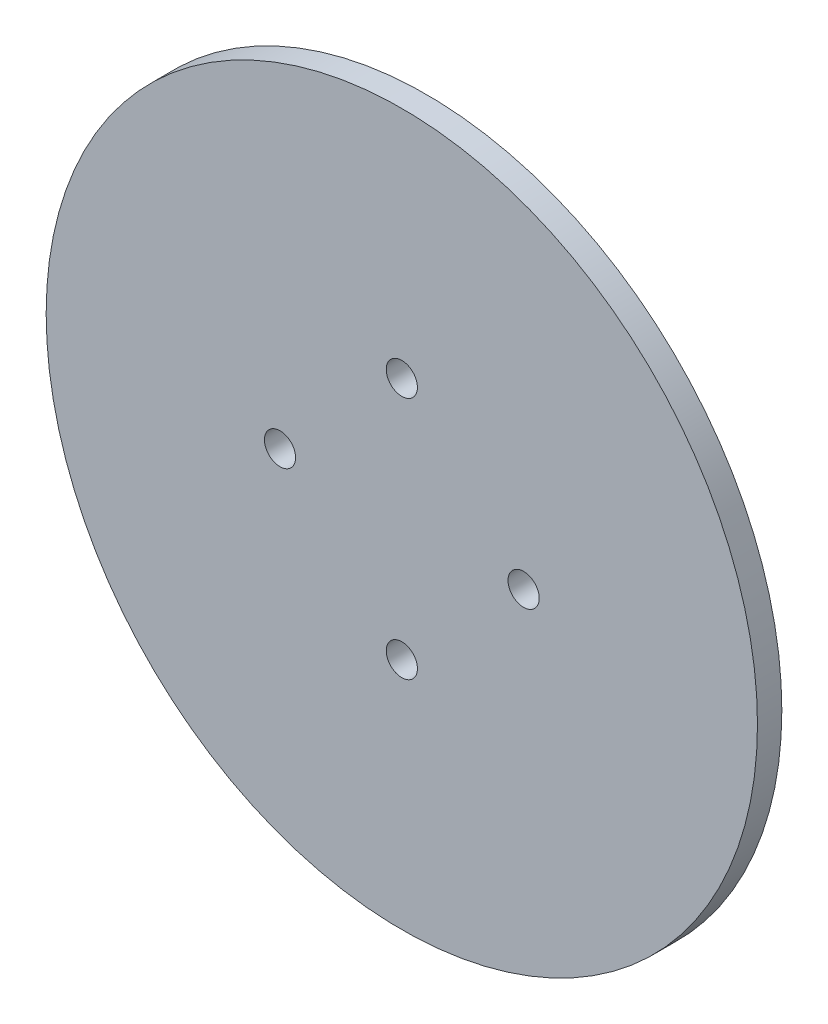
ISO-10303-21;
HEADER;
FILE_DESCRIPTION(('STEP AP214'),'2;1');
FILE_NAME('part.step','',(''),(''),'','','');
FILE_SCHEMA(('AUTOMOTIVE_DESIGN { 1 0 10303 214 1 1 1 1 }'));
ENDSEC;
DATA;
#1=APPLICATION_CONTEXT('core data for automotive mechanical design processes');
#2=APPLICATION_PROTOCOL_DEFINITION('international standard','automotive_design',2000,#1);
#3=PRODUCT_CONTEXT('',#1,'mechanical');
#4=PRODUCT('Part','Part','',(#3));
#5=PRODUCT_RELATED_PRODUCT_CATEGORY('part','',(#4));
#6=PRODUCT_DEFINITION_FORMATION('','',#4);
#7=PRODUCT_DEFINITION_CONTEXT('part definition',#1,'design');
#8=PRODUCT_DEFINITION('design','',#6,#7);
#9=PRODUCT_DEFINITION_SHAPE('','',#8);
#10=(LENGTH_UNIT() NAMED_UNIT(*) SI_UNIT(.MILLI.,.METRE.));
#11=(NAMED_UNIT(*) PLANE_ANGLE_UNIT() SI_UNIT($,.RADIAN.));
#12=(NAMED_UNIT(*) SI_UNIT($,.STERADIAN.) SOLID_ANGLE_UNIT());
#13=UNCERTAINTY_MEASURE_WITH_UNIT(LENGTH_MEASURE(1.E-05),#10,'distance_accuracy_value','');
#14=(GEOMETRIC_REPRESENTATION_CONTEXT(3) GLOBAL_UNCERTAINTY_ASSIGNED_CONTEXT((#13)) GLOBAL_UNIT_ASSIGNED_CONTEXT((#10,
#11,#12)) REPRESENTATION_CONTEXT('',''));
#15=CARTESIAN_POINT('',(0.,0.,0.));
#16=DIRECTION('',(0.,0.,1.));
#17=DIRECTION('',(1.,0.,0.));
#18=AXIS2_PLACEMENT_3D('',#15,#16,#17);
#19=CARTESIAN_POINT('',(-25.,2.61861100413235E-13,5.));
#20=DIRECTION('',(0.,0.,-1.));
#21=DIRECTION('',(-1.,0.,0.));
#22=AXIS2_PLACEMENT_3D('',#19,#20,#21);
#23=CYLINDRICAL_SURFACE('',#22,3.2);
#24=CARTESIAN_POINT('',(-25.,2.61861100413235E-13,5.));
#25=DIRECTION('',(0.,0.,1.));
#26=DIRECTION('',(1.,0.,0.));
#27=AXIS2_PLACEMENT_3D('',#24,#25,#26);
#28=CIRCLE('',#27,3.2);
#29=CARTESIAN_POINT('',(-21.8,2.61861100413235E-13,5.));
#30=VERTEX_POINT('',#29);
#31=EDGE_CURVE('E41',#30,#30,#28,.T.);
#32=ORIENTED_EDGE('',*,*,#31,.T.);
#33=EDGE_LOOP('',(#32));
#34=FACE_BOUND('',#33,.T.);
#35=CARTESIAN_POINT('',(-25.,2.61861100413235E-13,0.));
#36=DIRECTION('',(0.,0.,1.));
#37=DIRECTION('',(1.,0.,0.));
#38=AXIS2_PLACEMENT_3D('',#35,#36,#37);
#39=CIRCLE('',#38,3.2);
#40=CARTESIAN_POINT('',(-21.8,2.61861100413235E-13,0.));
#41=VERTEX_POINT('',#40);
#42=EDGE_CURVE('E58',#41,#41,#39,.T.);
#43=ORIENTED_EDGE('',*,*,#42,.F.);
#44=EDGE_LOOP('',(#43));
#45=FACE_BOUND('',#44,.T.);
#46=ADVANCED_FACE('F33',(#34,#45),#23,.F.);
#47=CARTESIAN_POINT('',(-1.74574066942157E-13,-25.,5.));
#48=DIRECTION('',(0.,0.,-1.));
#49=DIRECTION('',(-1.,0.,0.));
#50=AXIS2_PLACEMENT_3D('',#47,#48,#49);
#51=CYLINDRICAL_SURFACE('',#50,3.2);
#52=CARTESIAN_POINT('',(-1.74574066942157E-13,-25.,5.));
#53=DIRECTION('',(0.,0.,1.));
#54=DIRECTION('',(1.,0.,0.));
#55=AXIS2_PLACEMENT_3D('',#52,#53,#54);
#56=CIRCLE('',#55,3.2);
#57=CARTESIAN_POINT('',(3.19999999999983,-25.,5.));
#58=VERTEX_POINT('',#57);
#59=EDGE_CURVE('E46',#58,#58,#56,.T.);
#60=ORIENTED_EDGE('',*,*,#59,.T.);
#61=EDGE_LOOP('',(#60));
#62=FACE_BOUND('',#61,.T.);
#63=CARTESIAN_POINT('',(-1.74574066942157E-13,-25.,0.));
#64=DIRECTION('',(0.,0.,1.));
#65=DIRECTION('',(1.,0.,0.));
#66=AXIS2_PLACEMENT_3D('',#63,#64,#65);
#67=CIRCLE('',#66,3.2);
#68=CARTESIAN_POINT('',(3.19999999999983,-25.,0.));
#69=VERTEX_POINT('',#68);
#70=EDGE_CURVE('E56',#69,#69,#67,.T.);
#71=ORIENTED_EDGE('',*,*,#70,.F.);
#72=EDGE_LOOP('',(#71));
#73=FACE_BOUND('',#72,.T.);
#74=ADVANCED_FACE('F76',(#62,#73),#51,.F.);
#75=CARTESIAN_POINT('',(25.,0.,5.));
#76=DIRECTION('',(0.,0.,-1.));
#77=DIRECTION('',(-1.,0.,0.));
#78=AXIS2_PLACEMENT_3D('',#75,#76,#77);
#79=CYLINDRICAL_SURFACE('',#78,3.2);
#80=CARTESIAN_POINT('',(25.,0.,5.));
#81=DIRECTION('',(0.,0.,1.));
#82=DIRECTION('',(1.,0.,0.));
#83=AXIS2_PLACEMENT_3D('',#80,#81,#82);
#84=CIRCLE('',#83,3.2);
#85=CARTESIAN_POINT('',(28.2,0.,5.));
#86=VERTEX_POINT('',#85);
#87=EDGE_CURVE('E67',#86,#86,#84,.T.);
#88=ORIENTED_EDGE('',*,*,#87,.T.);
#89=EDGE_LOOP('',(#88));
#90=FACE_BOUND('',#89,.T.);
#91=CARTESIAN_POINT('',(25.,0.,0.));
#92=DIRECTION('',(0.,0.,1.));
#93=DIRECTION('',(1.,0.,0.));
#94=AXIS2_PLACEMENT_3D('',#91,#92,#93);
#95=CIRCLE('',#94,3.2);
#96=CARTESIAN_POINT('',(28.2,0.,0.));
#97=VERTEX_POINT('',#96);
#98=EDGE_CURVE('E53',#97,#97,#95,.T.);
#99=ORIENTED_EDGE('',*,*,#98,.F.);
#100=EDGE_LOOP('',(#99));
#101=FACE_BOUND('',#100,.T.);
#102=ADVANCED_FACE('F94',(#90,#101),#79,.F.);
#103=CARTESIAN_POINT('',(0.,25.,5.));
#104=DIRECTION('',(0.,0.,-1.));
#105=DIRECTION('',(-1.,0.,0.));
#106=AXIS2_PLACEMENT_3D('',#103,#104,#105);
#107=CYLINDRICAL_SURFACE('',#106,3.2);
#108=CARTESIAN_POINT('',(0.,25.,5.));
#109=DIRECTION('',(0.,0.,1.));
#110=DIRECTION('',(1.,0.,0.));
#111=AXIS2_PLACEMENT_3D('',#108,#109,#110);
#112=CIRCLE('',#111,3.2);
#113=CARTESIAN_POINT('',(3.2,25.,5.));
#114=VERTEX_POINT('',#113);
#115=EDGE_CURVE('E63',#114,#114,#112,.T.);
#116=ORIENTED_EDGE('',*,*,#115,.T.);
#117=EDGE_LOOP('',(#116));
#118=FACE_BOUND('',#117,.T.);
#119=CARTESIAN_POINT('',(0.,25.,0.));
#120=DIRECTION('',(0.,0.,1.));
#121=DIRECTION('',(1.,0.,0.));
#122=AXIS2_PLACEMENT_3D('',#119,#120,#121);
#123=CIRCLE('',#122,3.2);
#124=CARTESIAN_POINT('',(3.2,25.,0.));
#125=VERTEX_POINT('',#124);
#126=EDGE_CURVE('E50',#125,#125,#123,.T.);
#127=ORIENTED_EDGE('',*,*,#126,.F.);
#128=EDGE_LOOP('',(#127));
#129=FACE_BOUND('',#128,.T.);
#130=ADVANCED_FACE('F35',(#118,#129),#107,.F.);
#131=CARTESIAN_POINT('',(0.,0.,5.));
#132=DIRECTION('',(0.,0.,-1.));
#133=DIRECTION('',(-1.,0.,0.));
#134=AXIS2_PLACEMENT_3D('',#131,#132,#133);
#135=CYLINDRICAL_SURFACE('',#134,73.);
#136=CARTESIAN_POINT('',(0.,0.,5.));
#137=DIRECTION('',(0.,0.,1.));
#138=DIRECTION('',(1.,0.,0.));
#139=AXIS2_PLACEMENT_3D('',#136,#137,#138);
#140=CIRCLE('',#139,73.);
#141=CARTESIAN_POINT('',(73.,0.,5.));
#142=VERTEX_POINT('',#141);
#143=EDGE_CURVE('E10',#142,#142,#140,.T.);
#144=ORIENTED_EDGE('',*,*,#143,.F.);
#145=EDGE_LOOP('',(#144));
#146=FACE_BOUND('',#145,.T.);
#147=CARTESIAN_POINT('',(0.,0.,0.));
#148=DIRECTION('',(0.,0.,1.));
#149=DIRECTION('',(1.,0.,0.));
#150=AXIS2_PLACEMENT_3D('',#147,#148,#149);
#151=CIRCLE('',#150,73.);
#152=CARTESIAN_POINT('',(73.,0.,0.));
#153=VERTEX_POINT('',#152);
#154=EDGE_CURVE('E37',#153,#153,#151,.T.);
#155=ORIENTED_EDGE('',*,*,#154,.T.);
#156=EDGE_LOOP('',(#155));
#157=FACE_BOUND('',#156,.T.);
#158=ADVANCED_FACE('F83',(#146,#157),#135,.T.);
#159=CARTESIAN_POINT('',(0.,0.,5.));
#160=DIRECTION('',(0.,0.,1.));
#161=DIRECTION('',(1.,0.,0.));
#162=AXIS2_PLACEMENT_3D('',#159,#160,#161);
#163=PLANE('',#162);
#164=ORIENTED_EDGE('',*,*,#115,.F.);
#165=EDGE_LOOP('',(#164));
#166=FACE_BOUND('',#165,.T.);
#167=ORIENTED_EDGE('',*,*,#87,.F.);
#168=EDGE_LOOP('',(#167));
#169=FACE_BOUND('',#168,.T.);
#170=ORIENTED_EDGE('',*,*,#59,.F.);
#171=EDGE_LOOP('',(#170));
#172=FACE_BOUND('',#171,.T.);
#173=ORIENTED_EDGE('',*,*,#31,.F.);
#174=EDGE_LOOP('',(#173));
#175=FACE_BOUND('',#174,.T.);
#176=ORIENTED_EDGE('',*,*,#143,.T.);
#177=EDGE_LOOP('',(#176));
#178=FACE_BOUND('',#177,.T.);
#179=ADVANCED_FACE('F79',(#166,#169,#172,#175,#178),#163,.T.);
#180=CARTESIAN_POINT('',(0.,0.,0.));
#181=DIRECTION('',(0.,0.,1.));
#182=DIRECTION('',(1.,0.,0.));
#183=AXIS2_PLACEMENT_3D('',#180,#181,#182);
#184=PLANE('',#183);
#185=ORIENTED_EDGE('',*,*,#126,.T.);
#186=EDGE_LOOP('',(#185));
#187=FACE_BOUND('',#186,.T.);
#188=ORIENTED_EDGE('',*,*,#98,.T.);
#189=EDGE_LOOP('',(#188));
#190=FACE_BOUND('',#189,.T.);
#191=ORIENTED_EDGE('',*,*,#70,.T.);
#192=EDGE_LOOP('',(#191));
#193=FACE_BOUND('',#192,.T.);
#194=ORIENTED_EDGE('',*,*,#42,.T.);
#195=EDGE_LOOP('',(#194));
#196=FACE_BOUND('',#195,.T.);
#197=ORIENTED_EDGE('',*,*,#154,.F.);
#198=EDGE_LOOP('',(#197));
#199=FACE_BOUND('',#198,.T.);
#200=ADVANCED_FACE('F82',(#187,#190,#193,#196,#199),#184,.F.);
#201=CLOSED_SHELL('',(#46,#74,#102,#130,#158,#179,#200));
#202=MANIFOLD_SOLID_BREP('B2',#201);
#203=ADVANCED_BREP_SHAPE_REPRESENTATION('',(#18,#202),#14);
#204=SHAPE_DEFINITION_REPRESENTATION(#9,#203);
ENDSEC;
END-ISO-10303-21;
